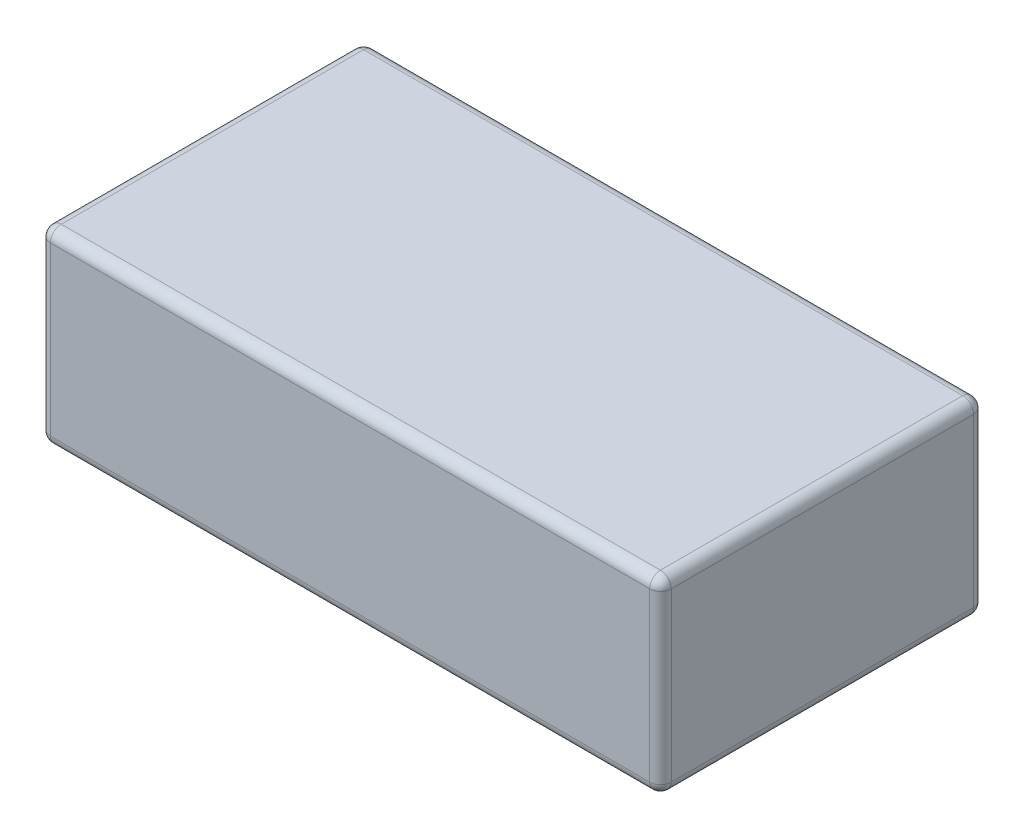
ISO-10303-21;
HEADER;
FILE_DESCRIPTION(('STEP AP214'),'2;1');
FILE_NAME('part.step','',(''),(''),'','','');
FILE_SCHEMA(('AUTOMOTIVE_DESIGN { 1 0 10303 214 1 1 1 1 }'));
ENDSEC;
DATA;
#1=APPLICATION_CONTEXT('core data for automotive mechanical design processes');
#2=APPLICATION_PROTOCOL_DEFINITION('international standard','automotive_design',2000,#1);
#3=PRODUCT_CONTEXT('',#1,'mechanical');
#4=PRODUCT('Part','Part','',(#3));
#5=PRODUCT_RELATED_PRODUCT_CATEGORY('part','',(#4));
#6=PRODUCT_DEFINITION_FORMATION('','',#4);
#7=PRODUCT_DEFINITION_CONTEXT('part definition',#1,'design');
#8=PRODUCT_DEFINITION('design','',#6,#7);
#9=PRODUCT_DEFINITION_SHAPE('','',#8);
#10=(LENGTH_UNIT() NAMED_UNIT(*) SI_UNIT(.MILLI.,.METRE.));
#11=(NAMED_UNIT(*) PLANE_ANGLE_UNIT() SI_UNIT($,.RADIAN.));
#12=(NAMED_UNIT(*) SI_UNIT($,.STERADIAN.) SOLID_ANGLE_UNIT());
#13=UNCERTAINTY_MEASURE_WITH_UNIT(LENGTH_MEASURE(1.E-05),#10,'distance_accuracy_value','');
#14=(GEOMETRIC_REPRESENTATION_CONTEXT(3) GLOBAL_UNCERTAINTY_ASSIGNED_CONTEXT((#13)) GLOBAL_UNIT_ASSIGNED_CONTEXT((#10,
#11,#12)) REPRESENTATION_CONTEXT('',''));
#15=CARTESIAN_POINT('',(0.,0.,0.));
#16=DIRECTION('',(0.,0.,1.));
#17=DIRECTION('',(1.,0.,0.));
#18=AXIS2_PLACEMENT_3D('',#15,#16,#17);
#19=CARTESIAN_POINT('',(57.5,-17.5,60.));
#20=DIRECTION('',(-1.,0.,0.));
#21=DIRECTION('',(0.,0.,1.));
#22=AXIS2_PLACEMENT_3D('',#19,#20,#21);
#23=PLANE('',#22);
#24=DIRECTION('',(0.,1.,0.));
#25=VECTOR('',#24,1.);
#26=CARTESIAN_POINT('',(57.5,-17.5,58.));
#27=LINE('',#26,#25);
#28=CARTESIAN_POINT('',(57.5,15.5,58.));
#29=VERTEX_POINT('',#28);
#30=CARTESIAN_POINT('',(57.5,-15.5,58.));
#31=VERTEX_POINT('',#30);
#32=EDGE_CURVE('E64',#29,#31,#27,.F.);
#33=ORIENTED_EDGE('',*,*,#32,.T.);
#34=DIRECTION('',(0.,0.,-1.));
#35=VECTOR('',#34,1.);
#36=CARTESIAN_POINT('',(57.5,-15.5,60.));
#37=LINE('',#36,#35);
#38=CARTESIAN_POINT('',(57.5,-15.5,2.));
#39=VERTEX_POINT('',#38);
#40=EDGE_CURVE('E12',#31,#39,#37,.T.);
#41=ORIENTED_EDGE('',*,*,#40,.T.);
#42=DIRECTION('',(0.,1.,0.));
#43=VECTOR('',#42,1.);
#44=CARTESIAN_POINT('',(57.5,17.5,2.));
#45=LINE('',#44,#43);
#46=CARTESIAN_POINT('',(57.5,15.5,2.));
#47=VERTEX_POINT('',#46);
#48=EDGE_CURVE('E49',#39,#47,#45,.T.);
#49=ORIENTED_EDGE('',*,*,#48,.T.);
#50=DIRECTION('',(0.,0.,-1.));
#51=VECTOR('',#50,1.);
#52=CARTESIAN_POINT('',(57.5,15.5,60.));
#53=LINE('',#52,#51);
#54=EDGE_CURVE('E252',#47,#29,#53,.F.);
#55=ORIENTED_EDGE('',*,*,#54,.T.);
#56=EDGE_LOOP('',(#33,#41,#49,#55));
#57=FACE_BOUND('',#56,.T.);
#58=ADVANCED_FACE('F40',(#57),#23,.F.);
#59=CARTESIAN_POINT('',(-57.5,17.5,60.));
#60=DIRECTION('',(0.,-1.,0.));
#61=DIRECTION('',(0.,0.,-1.));
#62=AXIS2_PLACEMENT_3D('',#59,#60,#61);
#63=PLANE('',#62);
#64=DIRECTION('',(-1.,0.,0.));
#65=VECTOR('',#64,1.);
#66=CARTESIAN_POINT('',(-57.5,17.5,2.));
#67=LINE('',#66,#65);
#68=CARTESIAN_POINT('',(55.5,17.5,2.));
#69=VERTEX_POINT('',#68);
#70=CARTESIAN_POINT('',(-55.5,17.5,2.));
#71=VERTEX_POINT('',#70);
#72=EDGE_CURVE('E240',#69,#71,#67,.T.);
#73=ORIENTED_EDGE('',*,*,#72,.T.);
#74=DIRECTION('',(0.,0.,-1.));
#75=VECTOR('',#74,1.);
#76=CARTESIAN_POINT('',(-55.5,17.5,60.));
#77=LINE('',#76,#75);
#78=CARTESIAN_POINT('',(-55.5,17.5,58.));
#79=VERTEX_POINT('',#78);
#80=EDGE_CURVE('E242',#71,#79,#77,.F.);
#81=ORIENTED_EDGE('',*,*,#80,.T.);
#82=DIRECTION('',(-1.,0.,0.));
#83=VECTOR('',#82,1.);
#84=CARTESIAN_POINT('',(-57.5,17.5,58.));
#85=LINE('',#84,#83);
#86=CARTESIAN_POINT('',(55.5,17.5,58.));
#87=VERTEX_POINT('',#86);
#88=EDGE_CURVE('E218',#79,#87,#85,.F.);
#89=ORIENTED_EDGE('',*,*,#88,.T.);
#90=DIRECTION('',(0.,0.,-1.));
#91=VECTOR('',#90,1.);
#92=CARTESIAN_POINT('',(55.5,17.5,60.));
#93=LINE('',#92,#91);
#94=EDGE_CURVE('E238',#87,#69,#93,.T.);
#95=ORIENTED_EDGE('',*,*,#94,.T.);
#96=EDGE_LOOP('',(#73,#81,#89,#95));
#97=FACE_BOUND('',#96,.T.);
#98=ADVANCED_FACE('F334',(#97),#63,.F.);
#99=CARTESIAN_POINT('',(-57.5,-17.5,60.));
#100=DIRECTION('',(1.,0.,0.));
#101=DIRECTION('',(0.,0.,-1.));
#102=AXIS2_PLACEMENT_3D('',#99,#100,#101);
#103=PLANE('',#102);
#104=DIRECTION('',(0.,-1.,0.));
#105=VECTOR('',#104,1.);
#106=CARTESIAN_POINT('',(-57.5,-17.5,2.));
#107=LINE('',#106,#105);
#108=CARTESIAN_POINT('',(-57.5,15.5,2.));
#109=VERTEX_POINT('',#108);
#110=CARTESIAN_POINT('',(-57.5,-15.5,2.));
#111=VERTEX_POINT('',#110);
#112=EDGE_CURVE('E284',#109,#111,#107,.T.);
#113=ORIENTED_EDGE('',*,*,#112,.T.);
#114=DIRECTION('',(0.,0.,-1.));
#115=VECTOR('',#114,1.);
#116=CARTESIAN_POINT('',(-57.5,-15.5,60.));
#117=LINE('',#116,#115);
#118=CARTESIAN_POINT('',(-57.5,-15.5,58.));
#119=VERTEX_POINT('',#118);
#120=EDGE_CURVE('E225',#111,#119,#117,.F.);
#121=ORIENTED_EDGE('',*,*,#120,.T.);
#122=DIRECTION('',(0.,-1.,0.));
#123=VECTOR('',#122,1.);
#124=CARTESIAN_POINT('',(-57.5,-17.5,58.));
#125=LINE('',#124,#123);
#126=CARTESIAN_POINT('',(-57.5,15.5,58.));
#127=VERTEX_POINT('',#126);
#128=EDGE_CURVE('E230',#119,#127,#125,.F.);
#129=ORIENTED_EDGE('',*,*,#128,.T.);
#130=DIRECTION('',(0.,0.,-1.));
#131=VECTOR('',#130,1.);
#132=CARTESIAN_POINT('',(-57.5,15.5,60.));
#133=LINE('',#132,#131);
#134=EDGE_CURVE('E280',#127,#109,#133,.T.);
#135=ORIENTED_EDGE('',*,*,#134,.T.);
#136=EDGE_LOOP('',(#113,#121,#129,#135));
#137=FACE_BOUND('',#136,.T.);
#138=ADVANCED_FACE('F282',(#137),#103,.F.);
#139=CARTESIAN_POINT('',(-57.5,-17.5,60.));
#140=DIRECTION('',(0.,1.,0.));
#141=DIRECTION('',(0.,0.,1.));
#142=AXIS2_PLACEMENT_3D('',#139,#140,#141);
#143=PLANE('',#142);
#144=DIRECTION('',(1.,0.,0.));
#145=VECTOR('',#144,1.);
#146=CARTESIAN_POINT('',(-57.5,-17.5,58.));
#147=LINE('',#146,#145);
#148=CARTESIAN_POINT('',(55.5,-17.5,58.));
#149=VERTEX_POINT('',#148);
#150=CARTESIAN_POINT('',(-55.5,-17.5,58.));
#151=VERTEX_POINT('',#150);
#152=EDGE_CURVE('E143',#149,#151,#147,.F.);
#153=ORIENTED_EDGE('',*,*,#152,.T.);
#154=DIRECTION('',(0.,0.,-1.));
#155=VECTOR('',#154,1.);
#156=CARTESIAN_POINT('',(-55.5,-17.5,60.));
#157=LINE('',#156,#155);
#158=CARTESIAN_POINT('',(-55.5,-17.5,2.));
#159=VERTEX_POINT('',#158);
#160=EDGE_CURVE('E139',#151,#159,#157,.T.);
#161=ORIENTED_EDGE('',*,*,#160,.T.);
#162=DIRECTION('',(1.,0.,0.));
#163=VECTOR('',#162,1.);
#164=CARTESIAN_POINT('',(57.5,-17.5,2.));
#165=LINE('',#164,#163);
#166=CARTESIAN_POINT('',(55.5,-17.5,2.));
#167=VERTEX_POINT('',#166);
#168=EDGE_CURVE('E133',#159,#167,#165,.T.);
#169=ORIENTED_EDGE('',*,*,#168,.T.);
#170=DIRECTION('',(0.,0.,-1.));
#171=VECTOR('',#170,1.);
#172=CARTESIAN_POINT('',(55.5,-17.5,60.));
#173=LINE('',#172,#171);
#174=EDGE_CURVE('E136',#167,#149,#173,.F.);
#175=ORIENTED_EDGE('',*,*,#174,.T.);
#176=EDGE_LOOP('',(#153,#161,#169,#175));
#177=FACE_BOUND('',#176,.T.);
#178=ADVANCED_FACE('F135',(#177),#143,.F.);
#179=CARTESIAN_POINT('',(0.,0.,60.));
#180=DIRECTION('',(0.,0.,-1.));
#181=DIRECTION('',(-1.,0.,0.));
#182=AXIS2_PLACEMENT_3D('',#179,#180,#181);
#183=PLANE('',#182);
#184=DIRECTION('',(-1.,0.,0.));
#185=VECTOR('',#184,1.);
#186=CARTESIAN_POINT('',(0.,15.5,60.));
#187=LINE('',#186,#185);
#188=CARTESIAN_POINT('',(55.5,15.5,60.));
#189=VERTEX_POINT('',#188);
#190=CARTESIAN_POINT('',(-55.5,15.5,60.));
#191=VERTEX_POINT('',#190);
#192=EDGE_CURVE('E220',#189,#191,#187,.T.);
#193=ORIENTED_EDGE('',*,*,#192,.T.);
#194=DIRECTION('',(0.,-1.,0.));
#195=VECTOR('',#194,1.);
#196=CARTESIAN_POINT('',(-55.5,0.,60.));
#197=LINE('',#196,#195);
#198=CARTESIAN_POINT('',(-55.5,-15.5,60.));
#199=VERTEX_POINT('',#198);
#200=EDGE_CURVE('E235',#191,#199,#197,.T.);
#201=ORIENTED_EDGE('',*,*,#200,.T.);
#202=DIRECTION('',(1.,0.,0.));
#203=VECTOR('',#202,1.);
#204=CARTESIAN_POINT('',(0.,-15.5,60.));
#205=LINE('',#204,#203);
#206=CARTESIAN_POINT('',(55.5,-15.5,60.));
#207=VERTEX_POINT('',#206);
#208=EDGE_CURVE('E227',#199,#207,#205,.T.);
#209=ORIENTED_EDGE('',*,*,#208,.T.);
#210=DIRECTION('',(0.,1.,0.));
#211=VECTOR('',#210,1.);
#212=CARTESIAN_POINT('',(55.5,0.,60.));
#213=LINE('',#212,#211);
#214=EDGE_CURVE('E224',#207,#189,#213,.T.);
#215=ORIENTED_EDGE('',*,*,#214,.T.);
#216=EDGE_LOOP('',(#193,#201,#209,#215));
#217=FACE_BOUND('',#216,.T.);
#218=ADVANCED_FACE('F499',(#217),#183,.F.);
#219=CARTESIAN_POINT('',(0.,0.,0.));
#220=DIRECTION('',(0.,0.,-1.));
#221=DIRECTION('',(-1.,0.,0.));
#222=AXIS2_PLACEMENT_3D('',#219,#220,#221);
#223=PLANE('',#222);
#224=DIRECTION('',(1.,0.,0.));
#225=VECTOR('',#224,1.);
#226=CARTESIAN_POINT('',(-57.5,-15.5,0.));
#227=LINE('',#226,#225);
#228=CARTESIAN_POINT('',(55.5,-15.5,0.));
#229=VERTEX_POINT('',#228);
#230=CARTESIAN_POINT('',(-55.5,-15.5,0.));
#231=VERTEX_POINT('',#230);
#232=EDGE_CURVE('E158',#229,#231,#227,.F.);
#233=ORIENTED_EDGE('',*,*,#232,.T.);
#234=DIRECTION('',(0.,-1.,0.));
#235=VECTOR('',#234,1.);
#236=CARTESIAN_POINT('',(-55.5,17.5,0.));
#237=LINE('',#236,#235);
#238=CARTESIAN_POINT('',(-55.5,15.5,0.));
#239=VERTEX_POINT('',#238);
#240=EDGE_CURVE('E249',#231,#239,#237,.F.);
#241=ORIENTED_EDGE('',*,*,#240,.T.);
#242=DIRECTION('',(-1.,0.,0.));
#243=VECTOR('',#242,1.);
#244=CARTESIAN_POINT('',(57.5,15.5,0.));
#245=LINE('',#244,#243);
#246=CARTESIAN_POINT('',(55.5,15.5,0.));
#247=VERTEX_POINT('',#246);
#248=EDGE_CURVE('E247',#239,#247,#245,.F.);
#249=ORIENTED_EDGE('',*,*,#248,.T.);
#250=DIRECTION('',(0.,1.,0.));
#251=VECTOR('',#250,1.);
#252=CARTESIAN_POINT('',(55.5,-17.5,0.));
#253=LINE('',#252,#251);
#254=EDGE_CURVE('E244',#247,#229,#253,.F.);
#255=ORIENTED_EDGE('',*,*,#254,.T.);
#256=EDGE_LOOP('',(#233,#241,#249,#255));
#257=FACE_BOUND('',#256,.T.);
#258=ADVANCED_FACE('F296',(#257),#223,.T.);
#259=CARTESIAN_POINT('',(55.5,15.5,60.));
#260=DIRECTION('',(0.,0.,-1.));
#261=DIRECTION('',(-1.,0.,0.));
#262=AXIS2_PLACEMENT_3D('',#259,#260,#261);
#263=CYLINDRICAL_SURFACE('',#262,2.);
#264=CARTESIAN_POINT('',(55.5,15.5,58.));
#265=DIRECTION('',(0.,0.,1.));
#266=DIRECTION('',(1.,0.,0.));
#267=AXIS2_PLACEMENT_3D('',#264,#265,#266);
#268=CIRCLE('',#267,2.);
#269=EDGE_CURVE('E44',#29,#87,#268,.T.);
#270=ORIENTED_EDGE('',*,*,#269,.F.);
#271=ORIENTED_EDGE('',*,*,#54,.F.);
#272=CARTESIAN_POINT('',(55.5,15.5,2.));
#273=DIRECTION('',(0.,0.,-1.));
#274=DIRECTION('',(-1.,0.,0.));
#275=AXIS2_PLACEMENT_3D('',#272,#273,#274);
#276=CIRCLE('',#275,2.);
#277=EDGE_CURVE('E198',#69,#47,#276,.T.);
#278=ORIENTED_EDGE('',*,*,#277,.F.);
#279=ORIENTED_EDGE('',*,*,#94,.F.);
#280=EDGE_LOOP('',(#270,#271,#278,#279));
#281=FACE_BOUND('',#280,.T.);
#282=ADVANCED_FACE('F42',(#281),#263,.T.);
#283=CARTESIAN_POINT('',(55.5,15.5,58.));
#284=DIRECTION('',(0.,0.,1.));
#285=DIRECTION('',(1.,0.,0.));
#286=AXIS2_PLACEMENT_3D('',#283,#284,#285);
#287=SPHERICAL_SURFACE('',#286,2.);
#288=CARTESIAN_POINT('',(55.5,15.5,58.));
#289=DIRECTION('',(0.,1.,0.));
#290=DIRECTION('',(0.,0.,1.));
#291=AXIS2_PLACEMENT_3D('',#288,#289,#290);
#292=CIRCLE('',#291,2.);
#293=EDGE_CURVE('E193',#29,#189,#292,.F.);
#294=ORIENTED_EDGE('',*,*,#293,.F.);
#295=ORIENTED_EDGE('',*,*,#269,.T.);
#296=CARTESIAN_POINT('',(55.5,15.5,58.));
#297=DIRECTION('',(1.,0.,0.));
#298=DIRECTION('',(0.,0.,-1.));
#299=AXIS2_PLACEMENT_3D('',#296,#297,#298);
#300=CIRCLE('',#299,2.);
#301=EDGE_CURVE('E196',#189,#87,#300,.F.);
#302=ORIENTED_EDGE('',*,*,#301,.F.);
#303=EDGE_LOOP('',(#294,#295,#302));
#304=FACE_BOUND('',#303,.T.);
#305=ADVANCED_FACE('F209',(#304),#287,.T.);
#306=CARTESIAN_POINT('',(55.5,15.5,2.));
#307=DIRECTION('',(0.,0.,1.));
#308=DIRECTION('',(1.,0.,0.));
#309=AXIS2_PLACEMENT_3D('',#306,#307,#308);
#310=SPHERICAL_SURFACE('',#309,2.);
#311=CARTESIAN_POINT('',(55.5,15.5,2.));
#312=DIRECTION('',(1.,0.,0.));
#313=DIRECTION('',(0.,0.,-1.));
#314=AXIS2_PLACEMENT_3D('',#311,#312,#313);
#315=CIRCLE('',#314,2.);
#316=EDGE_CURVE('E187',#69,#247,#315,.F.);
#317=ORIENTED_EDGE('',*,*,#316,.F.);
#318=ORIENTED_EDGE('',*,*,#277,.T.);
#319=CARTESIAN_POINT('',(55.5,15.5,2.));
#320=DIRECTION('',(0.,1.,0.));
#321=DIRECTION('',(0.,0.,1.));
#322=AXIS2_PLACEMENT_3D('',#319,#320,#321);
#323=CIRCLE('',#322,2.);
#324=EDGE_CURVE('E190',#247,#47,#323,.F.);
#325=ORIENTED_EDGE('',*,*,#324,.F.);
#326=EDGE_LOOP('',(#317,#318,#325));
#327=FACE_BOUND('',#326,.T.);
#328=ADVANCED_FACE('F325',(#327),#310,.T.);
#329=CARTESIAN_POINT('',(0.,15.5,58.));
#330=DIRECTION('',(-1.,0.,0.));
#331=DIRECTION('',(0.,0.,1.));
#332=AXIS2_PLACEMENT_3D('',#329,#330,#331);
#333=CYLINDRICAL_SURFACE('',#332,2.);
#334=ORIENTED_EDGE('',*,*,#301,.T.);
#335=ORIENTED_EDGE('',*,*,#88,.F.);
#336=CARTESIAN_POINT('',(-55.5,15.5,58.));
#337=DIRECTION('',(-1.,0.,0.));
#338=DIRECTION('',(0.,0.,1.));
#339=AXIS2_PLACEMENT_3D('',#336,#337,#338);
#340=CIRCLE('',#339,2.);
#341=EDGE_CURVE('E182',#191,#79,#340,.T.);
#342=ORIENTED_EDGE('',*,*,#341,.F.);
#343=ORIENTED_EDGE('',*,*,#192,.F.);
#344=EDGE_LOOP('',(#334,#335,#342,#343));
#345=FACE_BOUND('',#344,.T.);
#346=ADVANCED_FACE('F216',(#345),#333,.T.);
#347=CARTESIAN_POINT('',(55.5,0.,58.));
#348=DIRECTION('',(0.,1.,0.));
#349=DIRECTION('',(0.,0.,1.));
#350=AXIS2_PLACEMENT_3D('',#347,#348,#349);
#351=CYLINDRICAL_SURFACE('',#350,2.);
#352=ORIENTED_EDGE('',*,*,#293,.T.);
#353=ORIENTED_EDGE('',*,*,#214,.F.);
#354=CARTESIAN_POINT('',(55.5,-15.5,58.));
#355=DIRECTION('',(0.,-1.,0.));
#356=DIRECTION('',(0.,0.,-1.));
#357=AXIS2_PLACEMENT_3D('',#354,#355,#356);
#358=CIRCLE('',#357,2.);
#359=EDGE_CURVE('E179',#31,#207,#358,.T.);
#360=ORIENTED_EDGE('',*,*,#359,.F.);
#361=ORIENTED_EDGE('',*,*,#32,.F.);
#362=EDGE_LOOP('',(#352,#353,#360,#361));
#363=FACE_BOUND('',#362,.T.);
#364=ADVANCED_FACE('F304',(#363),#351,.T.);
#365=CARTESIAN_POINT('',(55.5,-15.5,60.));
#366=DIRECTION('',(0.,0.,-1.));
#367=DIRECTION('',(-1.,0.,0.));
#368=AXIS2_PLACEMENT_3D('',#365,#366,#367);
#369=CYLINDRICAL_SURFACE('',#368,2.);
#370=CARTESIAN_POINT('',(55.5,-15.5,2.));
#371=DIRECTION('',(0.,0.,-1.));
#372=DIRECTION('',(-1.,0.,0.));
#373=AXIS2_PLACEMENT_3D('',#370,#371,#372);
#374=CIRCLE('',#373,2.);
#375=EDGE_CURVE('E147',#39,#167,#374,.T.);
#376=ORIENTED_EDGE('',*,*,#375,.F.);
#377=ORIENTED_EDGE('',*,*,#40,.F.);
#378=CARTESIAN_POINT('',(55.5,-15.5,58.));
#379=DIRECTION('',(0.,0.,1.));
#380=DIRECTION('',(1.,0.,0.));
#381=AXIS2_PLACEMENT_3D('',#378,#379,#380);
#382=CIRCLE('',#381,2.);
#383=EDGE_CURVE('E150',#149,#31,#382,.T.);
#384=ORIENTED_EDGE('',*,*,#383,.F.);
#385=ORIENTED_EDGE('',*,*,#174,.F.);
#386=EDGE_LOOP('',(#376,#377,#384,#385));
#387=FACE_BOUND('',#386,.T.);
#388=ADVANCED_FACE('F146',(#387),#369,.T.);
#389=CARTESIAN_POINT('',(55.5,-17.5,2.));
#390=DIRECTION('',(0.,-1.,0.));
#391=DIRECTION('',(0.,0.,-1.));
#392=AXIS2_PLACEMENT_3D('',#389,#390,#391);
#393=CYLINDRICAL_SURFACE('',#392,2.);
#394=ORIENTED_EDGE('',*,*,#324,.T.);
#395=ORIENTED_EDGE('',*,*,#48,.F.);
#396=CARTESIAN_POINT('',(55.5,-15.5,2.));
#397=DIRECTION('',(0.,-1.,0.));
#398=DIRECTION('',(0.,0.,-1.));
#399=AXIS2_PLACEMENT_3D('',#396,#397,#398);
#400=CIRCLE('',#399,2.);
#401=EDGE_CURVE('E57',#229,#39,#400,.T.);
#402=ORIENTED_EDGE('',*,*,#401,.F.);
#403=ORIENTED_EDGE('',*,*,#254,.F.);
#404=EDGE_LOOP('',(#394,#395,#402,#403));
#405=FACE_BOUND('',#404,.T.);
#406=ADVANCED_FACE('F300',(#405),#393,.T.);
#407=CARTESIAN_POINT('',(-57.5,15.5,2.));
#408=DIRECTION('',(1.,0.,0.));
#409=DIRECTION('',(0.,0.,-1.));
#410=AXIS2_PLACEMENT_3D('',#407,#408,#409);
#411=CYLINDRICAL_SURFACE('',#410,2.);
#412=ORIENTED_EDGE('',*,*,#316,.T.);
#413=ORIENTED_EDGE('',*,*,#248,.F.);
#414=CARTESIAN_POINT('',(-55.5,15.5,2.));
#415=DIRECTION('',(-1.,0.,0.));
#416=DIRECTION('',(0.,0.,1.));
#417=AXIS2_PLACEMENT_3D('',#414,#415,#416);
#418=CIRCLE('',#417,2.);
#419=EDGE_CURVE('E174',#71,#239,#418,.T.);
#420=ORIENTED_EDGE('',*,*,#419,.F.);
#421=ORIENTED_EDGE('',*,*,#72,.F.);
#422=EDGE_LOOP('',(#412,#413,#420,#421));
#423=FACE_BOUND('',#422,.T.);
#424=ADVANCED_FACE('F324',(#423),#411,.T.);
#425=CARTESIAN_POINT('',(-55.5,15.5,60.));
#426=DIRECTION('',(0.,0.,-1.));
#427=DIRECTION('',(-1.,0.,0.));
#428=AXIS2_PLACEMENT_3D('',#425,#426,#427);
#429=CYLINDRICAL_SURFACE('',#428,2.);
#430=CARTESIAN_POINT('',(-55.5,15.5,58.));
#431=DIRECTION('',(0.,0.,1.));
#432=DIRECTION('',(1.,0.,0.));
#433=AXIS2_PLACEMENT_3D('',#430,#431,#432);
#434=CIRCLE('',#433,2.);
#435=EDGE_CURVE('E184',#79,#127,#434,.T.);
#436=ORIENTED_EDGE('',*,*,#435,.F.);
#437=ORIENTED_EDGE('',*,*,#80,.F.);
#438=CARTESIAN_POINT('',(-55.5,15.5,2.));
#439=DIRECTION('',(0.,0.,-1.));
#440=DIRECTION('',(-1.,0.,0.));
#441=AXIS2_PLACEMENT_3D('',#438,#439,#440);
#442=CIRCLE('',#441,2.);
#443=EDGE_CURVE('E171',#109,#71,#442,.T.);
#444=ORIENTED_EDGE('',*,*,#443,.F.);
#445=ORIENTED_EDGE('',*,*,#134,.F.);
#446=EDGE_LOOP('',(#436,#437,#444,#445));
#447=FACE_BOUND('',#446,.T.);
#448=ADVANCED_FACE('F318',(#447),#429,.T.);
#449=CARTESIAN_POINT('',(-55.5,15.5,58.));
#450=DIRECTION('',(0.,0.,1.));
#451=DIRECTION('',(1.,0.,0.));
#452=AXIS2_PLACEMENT_3D('',#449,#450,#451);
#453=SPHERICAL_SURFACE('',#452,2.);
#454=ORIENTED_EDGE('',*,*,#341,.T.);
#455=ORIENTED_EDGE('',*,*,#435,.T.);
#456=CARTESIAN_POINT('',(-55.5,15.5,58.));
#457=DIRECTION('',(0.,1.,0.));
#458=DIRECTION('',(0.,0.,1.));
#459=AXIS2_PLACEMENT_3D('',#456,#457,#458);
#460=CIRCLE('',#459,2.);
#461=EDGE_CURVE('E163',#191,#127,#460,.F.);
#462=ORIENTED_EDGE('',*,*,#461,.F.);
#463=EDGE_LOOP('',(#454,#455,#462));
#464=FACE_BOUND('',#463,.T.);
#465=ADVANCED_FACE('F363',(#464),#453,.T.);
#466=CARTESIAN_POINT('',(55.5,-15.5,58.));
#467=DIRECTION('',(0.,0.,1.));
#468=DIRECTION('',(1.,0.,0.));
#469=AXIS2_PLACEMENT_3D('',#466,#467,#468);
#470=SPHERICAL_SURFACE('',#469,2.);
#471=ORIENTED_EDGE('',*,*,#383,.T.);
#472=ORIENTED_EDGE('',*,*,#359,.T.);
#473=CARTESIAN_POINT('',(55.5,-15.5,58.));
#474=DIRECTION('',(1.,0.,0.));
#475=DIRECTION('',(0.,0.,-1.));
#476=AXIS2_PLACEMENT_3D('',#473,#474,#475);
#477=CIRCLE('',#476,2.);
#478=EDGE_CURVE('E159',#149,#207,#477,.F.);
#479=ORIENTED_EDGE('',*,*,#478,.F.);
#480=EDGE_LOOP('',(#471,#472,#479));
#481=FACE_BOUND('',#480,.T.);
#482=ADVANCED_FACE('F306',(#481),#470,.T.);
#483=CARTESIAN_POINT('',(55.5,-15.5,2.));
#484=DIRECTION('',(0.,0.,1.));
#485=DIRECTION('',(1.,0.,0.));
#486=AXIS2_PLACEMENT_3D('',#483,#484,#485);
#487=SPHERICAL_SURFACE('',#486,2.);
#488=ORIENTED_EDGE('',*,*,#401,.T.);
#489=ORIENTED_EDGE('',*,*,#375,.T.);
#490=CARTESIAN_POINT('',(55.5,-15.5,2.));
#491=DIRECTION('',(1.,0.,0.));
#492=DIRECTION('',(0.,0.,-1.));
#493=AXIS2_PLACEMENT_3D('',#490,#491,#492);
#494=CIRCLE('',#493,2.);
#495=EDGE_CURVE('E154',#229,#167,#494,.F.);
#496=ORIENTED_EDGE('',*,*,#495,.F.);
#497=EDGE_LOOP('',(#488,#489,#496));
#498=FACE_BOUND('',#497,.T.);
#499=ADVANCED_FACE('F153',(#498),#487,.T.);
#500=CARTESIAN_POINT('',(-55.5,15.5,2.));
#501=DIRECTION('',(0.,0.,1.));
#502=DIRECTION('',(1.,0.,0.));
#503=AXIS2_PLACEMENT_3D('',#500,#501,#502);
#504=SPHERICAL_SURFACE('',#503,2.);
#505=ORIENTED_EDGE('',*,*,#443,.T.);
#506=ORIENTED_EDGE('',*,*,#419,.T.);
#507=CARTESIAN_POINT('',(-55.5,15.5,2.));
#508=DIRECTION('',(0.,1.,0.));
#509=DIRECTION('',(-1.,0.,0.));
#510=AXIS2_PLACEMENT_3D('',#507,#508,#509);
#511=CIRCLE('',#510,2.);
#512=EDGE_CURVE('E160',#109,#239,#511,.F.);
#513=ORIENTED_EDGE('',*,*,#512,.F.);
#514=EDGE_LOOP('',(#505,#506,#513));
#515=FACE_BOUND('',#514,.T.);
#516=ADVANCED_FACE('F321',(#515),#504,.T.);
#517=CARTESIAN_POINT('',(-55.5,0.,58.));
#518=DIRECTION('',(0.,-1.,0.));
#519=DIRECTION('',(0.,0.,-1.));
#520=AXIS2_PLACEMENT_3D('',#517,#518,#519);
#521=CYLINDRICAL_SURFACE('',#520,2.);
#522=ORIENTED_EDGE('',*,*,#461,.T.);
#523=ORIENTED_EDGE('',*,*,#128,.F.);
#524=CARTESIAN_POINT('',(-55.5,-15.5,58.));
#525=DIRECTION('',(0.,-1.,0.));
#526=DIRECTION('',(0.,0.,-1.));
#527=AXIS2_PLACEMENT_3D('',#524,#525,#526);
#528=CIRCLE('',#527,2.);
#529=EDGE_CURVE('E165',#199,#119,#528,.T.);
#530=ORIENTED_EDGE('',*,*,#529,.F.);
#531=ORIENTED_EDGE('',*,*,#200,.F.);
#532=EDGE_LOOP('',(#522,#523,#530,#531));
#533=FACE_BOUND('',#532,.T.);
#534=ADVANCED_FACE('F277',(#533),#521,.T.);
#535=CARTESIAN_POINT('',(0.,-15.5,58.));
#536=DIRECTION('',(1.,0.,0.));
#537=DIRECTION('',(0.,0.,-1.));
#538=AXIS2_PLACEMENT_3D('',#535,#536,#537);
#539=CYLINDRICAL_SURFACE('',#538,2.);
#540=ORIENTED_EDGE('',*,*,#478,.T.);
#541=ORIENTED_EDGE('',*,*,#208,.F.);
#542=CARTESIAN_POINT('',(-55.5,-15.5,58.));
#543=DIRECTION('',(-1.,0.,0.));
#544=DIRECTION('',(0.,0.,1.));
#545=AXIS2_PLACEMENT_3D('',#542,#543,#544);
#546=CIRCLE('',#545,2.);
#547=EDGE_CURVE('E266',#151,#199,#546,.T.);
#548=ORIENTED_EDGE('',*,*,#547,.F.);
#549=ORIENTED_EDGE('',*,*,#152,.F.);
#550=EDGE_LOOP('',(#540,#541,#548,#549));
#551=FACE_BOUND('',#550,.T.);
#552=ADVANCED_FACE('F309',(#551),#539,.T.);
#553=CARTESIAN_POINT('',(-57.5,-15.5,2.));
#554=DIRECTION('',(-1.,0.,0.));
#555=DIRECTION('',(0.,0.,1.));
#556=AXIS2_PLACEMENT_3D('',#553,#554,#555);
#557=CYLINDRICAL_SURFACE('',#556,2.);
#558=ORIENTED_EDGE('',*,*,#495,.T.);
#559=ORIENTED_EDGE('',*,*,#168,.F.);
#560=CARTESIAN_POINT('',(-55.5,-15.5,2.));
#561=DIRECTION('',(-1.,0.,0.));
#562=DIRECTION('',(0.,0.,1.));
#563=AXIS2_PLACEMENT_3D('',#560,#561,#562);
#564=CIRCLE('',#563,2.);
#565=EDGE_CURVE('E263',#231,#159,#564,.T.);
#566=ORIENTED_EDGE('',*,*,#565,.F.);
#567=ORIENTED_EDGE('',*,*,#232,.F.);
#568=EDGE_LOOP('',(#558,#559,#566,#567));
#569=FACE_BOUND('',#568,.T.);
#570=ADVANCED_FACE('F157',(#569),#557,.T.);
#571=CARTESIAN_POINT('',(-55.5,-17.5,2.));
#572=DIRECTION('',(0.,1.,0.));
#573=DIRECTION('',(0.,0.,1.));
#574=AXIS2_PLACEMENT_3D('',#571,#572,#573);
#575=CYLINDRICAL_SURFACE('',#574,2.);
#576=ORIENTED_EDGE('',*,*,#512,.T.);
#577=ORIENTED_EDGE('',*,*,#240,.F.);
#578=CARTESIAN_POINT('',(-55.5,-15.5,2.));
#579=DIRECTION('',(0.,-1.,0.));
#580=DIRECTION('',(0.,0.,-1.));
#581=AXIS2_PLACEMENT_3D('',#578,#579,#580);
#582=CIRCLE('',#581,2.);
#583=EDGE_CURVE('E260',#111,#231,#582,.T.);
#584=ORIENTED_EDGE('',*,*,#583,.F.);
#585=ORIENTED_EDGE('',*,*,#112,.F.);
#586=EDGE_LOOP('',(#576,#577,#584,#585));
#587=FACE_BOUND('',#586,.T.);
#588=ADVANCED_FACE('F293',(#587),#575,.T.);
#589=CARTESIAN_POINT('',(-55.5,-15.5,58.));
#590=DIRECTION('',(0.,0.,1.));
#591=DIRECTION('',(1.,0.,0.));
#592=AXIS2_PLACEMENT_3D('',#589,#590,#591);
#593=SPHERICAL_SURFACE('',#592,2.);
#594=ORIENTED_EDGE('',*,*,#547,.T.);
#595=ORIENTED_EDGE('',*,*,#529,.T.);
#596=CARTESIAN_POINT('',(-55.5,-15.5,58.));
#597=DIRECTION('',(0.,0.,1.));
#598=DIRECTION('',(1.,0.,0.));
#599=AXIS2_PLACEMENT_3D('',#596,#597,#598);
#600=CIRCLE('',#599,2.);
#601=EDGE_CURVE('E258',#151,#119,#600,.F.);
#602=ORIENTED_EDGE('',*,*,#601,.F.);
#603=EDGE_LOOP('',(#594,#595,#602));
#604=FACE_BOUND('',#603,.T.);
#605=ADVANCED_FACE('F272',(#604),#593,.T.);
#606=CARTESIAN_POINT('',(-55.5,-15.5,2.));
#607=DIRECTION('',(0.,0.,1.));
#608=DIRECTION('',(1.,0.,0.));
#609=AXIS2_PLACEMENT_3D('',#606,#607,#608);
#610=SPHERICAL_SURFACE('',#609,2.);
#611=ORIENTED_EDGE('',*,*,#583,.T.);
#612=ORIENTED_EDGE('',*,*,#565,.T.);
#613=CARTESIAN_POINT('',(-55.5,-15.5,2.));
#614=DIRECTION('',(0.,0.,-1.));
#615=DIRECTION('',(-1.,0.,0.));
#616=AXIS2_PLACEMENT_3D('',#613,#614,#615);
#617=CIRCLE('',#616,2.);
#618=EDGE_CURVE('E256',#111,#159,#617,.F.);
#619=ORIENTED_EDGE('',*,*,#618,.F.);
#620=EDGE_LOOP('',(#611,#612,#619));
#621=FACE_BOUND('',#620,.T.);
#622=ADVANCED_FACE('F290',(#621),#610,.T.);
#623=CARTESIAN_POINT('',(-55.5,-15.5,60.));
#624=DIRECTION('',(0.,0.,-1.));
#625=DIRECTION('',(-1.,0.,0.));
#626=AXIS2_PLACEMENT_3D('',#623,#624,#625);
#627=CYLINDRICAL_SURFACE('',#626,2.);
#628=ORIENTED_EDGE('',*,*,#601,.T.);
#629=ORIENTED_EDGE('',*,*,#120,.F.);
#630=ORIENTED_EDGE('',*,*,#618,.T.);
#631=ORIENTED_EDGE('',*,*,#160,.F.);
#632=EDGE_LOOP('',(#628,#629,#630,#631));
#633=FACE_BOUND('',#632,.T.);
#634=ADVANCED_FACE('F288',(#633),#627,.T.);
#635=CLOSED_SHELL('',(#58,#98,#138,#178,#218,#258,#282,#305,#328,#346,#364,#388,#406,#424,#448,
#465,#482,#499,#516,#534,#552,#570,#588,#605,#622,#634));
#636=MANIFOLD_SOLID_BREP('B2',#635);
#637=ADVANCED_BREP_SHAPE_REPRESENTATION('',(#18,#636),#14);
#638=SHAPE_DEFINITION_REPRESENTATION(#9,#637);
ENDSEC;
END-ISO-10303-21;
